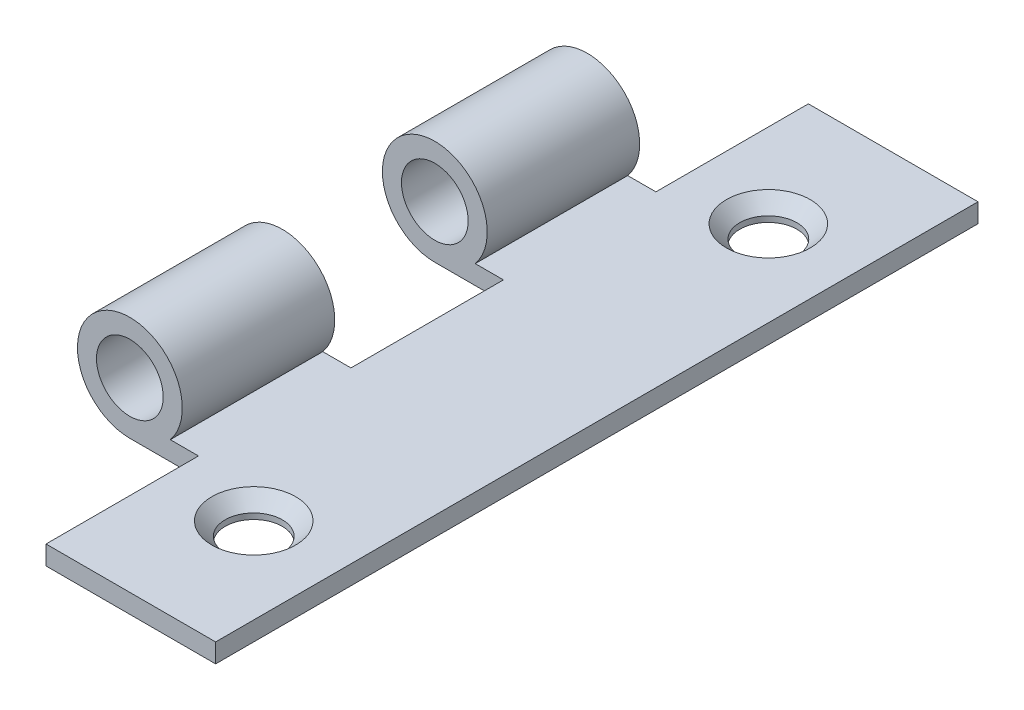
ISO-10303-21;
HEADER;
FILE_DESCRIPTION(('STEP AP214'),'2;1');
FILE_NAME('part.step','',(''),(''),'','','');
FILE_SCHEMA(('AUTOMOTIVE_DESIGN { 1 0 10303 214 1 1 1 1 }'));
ENDSEC;
DATA;
#1=APPLICATION_CONTEXT('core data for automotive mechanical design processes');
#2=APPLICATION_PROTOCOL_DEFINITION('international standard','automotive_design',2000,#1);
#3=PRODUCT_CONTEXT('',#1,'mechanical');
#4=PRODUCT('Part','Part','',(#3));
#5=PRODUCT_RELATED_PRODUCT_CATEGORY('part','',(#4));
#6=PRODUCT_DEFINITION_FORMATION('','',#4);
#7=PRODUCT_DEFINITION_CONTEXT('part definition',#1,'design');
#8=PRODUCT_DEFINITION('design','',#6,#7);
#9=PRODUCT_DEFINITION_SHAPE('','',#8);
#10=(LENGTH_UNIT() NAMED_UNIT(*) SI_UNIT(.MILLI.,.METRE.));
#11=(NAMED_UNIT(*) PLANE_ANGLE_UNIT() SI_UNIT($,.RADIAN.));
#12=(NAMED_UNIT(*) SI_UNIT($,.STERADIAN.) SOLID_ANGLE_UNIT());
#13=UNCERTAINTY_MEASURE_WITH_UNIT(LENGTH_MEASURE(1.E-05),#10,'distance_accuracy_value','');
#14=(GEOMETRIC_REPRESENTATION_CONTEXT(3) GLOBAL_UNCERTAINTY_ASSIGNED_CONTEXT((#13)) GLOBAL_UNIT_ASSIGNED_CONTEXT((#10,
#11,#12)) REPRESENTATION_CONTEXT('',''));
#15=CARTESIAN_POINT('',(0.,0.,0.));
#16=DIRECTION('',(0.,0.,1.));
#17=DIRECTION('',(1.,0.,0.));
#18=AXIS2_PLACEMENT_3D('',#15,#16,#17);
#19=CARTESIAN_POINT('',(12.5,-1.75,40.));
#20=DIRECTION('',(0.,-1.,0.));
#21=DIRECTION('',(1.,0.,0.));
#22=AXIS2_PLACEMENT_3D('',#19,#20,#21);
#23=PLANE('',#22);
#24=CARTESIAN_POINT('',(8.,-1.75,33.5));
#25=DIRECTION('',(0.,1.,0.));
#26=DIRECTION('',(0.,0.,1.));
#27=AXIS2_PLACEMENT_3D('',#24,#25,#26);
#28=CIRCLE('',#27,2.2);
#29=CARTESIAN_POINT('',(8.,-1.75,35.7));
#30=VERTEX_POINT('',#29);
#31=EDGE_CURVE('E236',#30,#30,#28,.T.);
#32=ORIENTED_EDGE('',*,*,#31,.F.);
#33=EDGE_LOOP('',(#32));
#34=FACE_BOUND('',#33,.T.);
#35=CARTESIAN_POINT('',(8.,-1.75,6.5));
#36=DIRECTION('',(0.,1.,0.));
#37=DIRECTION('',(0.,0.,1.));
#38=AXIS2_PLACEMENT_3D('',#35,#36,#37);
#39=CIRCLE('',#38,2.2);
#40=CARTESIAN_POINT('',(8.,-1.75,8.7));
#41=VERTEX_POINT('',#40);
#42=EDGE_CURVE('E226',#41,#41,#39,.T.);
#43=ORIENTED_EDGE('',*,*,#42,.F.);
#44=EDGE_LOOP('',(#43));
#45=FACE_BOUND('',#44,.T.);
#46=DIRECTION('',(1.,0.,0.));
#47=VECTOR('',#46,1.);
#48=CARTESIAN_POINT('',(12.5,-1.75,8.));
#49=LINE('',#48,#47);
#50=CARTESIAN_POINT('',(2.12132034355964,-1.75,8.));
#51=VERTEX_POINT('',#50);
#52=CARTESIAN_POINT('',(3.6,-1.75,8.));
#53=VERTEX_POINT('',#52);
#54=EDGE_CURVE('E125',#51,#53,#49,.T.);
#55=ORIENTED_EDGE('',*,*,#54,.F.);
#56=DIRECTION('',(0.,0.,-1.));
#57=VECTOR('',#56,1.);
#58=CARTESIAN_POINT('',(2.12132034355964,-1.75,40.));
#59=LINE('',#58,#57);
#60=CARTESIAN_POINT('',(2.12132034355964,-1.75,16.));
#61=VERTEX_POINT('',#60);
#62=EDGE_CURVE('E208',#61,#51,#59,.T.);
#63=ORIENTED_EDGE('',*,*,#62,.F.);
#64=DIRECTION('',(-1.,0.,0.));
#65=VECTOR('',#64,1.);
#66=CARTESIAN_POINT('',(12.5,-1.75,16.));
#67=LINE('',#66,#65);
#68=CARTESIAN_POINT('',(3.6,-1.75,16.));
#69=VERTEX_POINT('',#68);
#70=EDGE_CURVE('E175',#69,#61,#67,.T.);
#71=ORIENTED_EDGE('',*,*,#70,.F.);
#72=DIRECTION('',(0.,0.,-1.));
#73=VECTOR('',#72,1.);
#74=CARTESIAN_POINT('',(3.59999999999999,-1.75,40.));
#75=LINE('',#74,#73);
#76=CARTESIAN_POINT('',(3.6,-1.75,24.));
#77=VERTEX_POINT('',#76);
#78=EDGE_CURVE('E186',#77,#69,#75,.T.);
#79=ORIENTED_EDGE('',*,*,#78,.F.);
#80=DIRECTION('',(1.,0.,0.));
#81=VECTOR('',#80,1.);
#82=CARTESIAN_POINT('',(12.5,-1.75,24.));
#83=LINE('',#82,#81);
#84=CARTESIAN_POINT('',(2.12132034355964,-1.75,24.));
#85=VERTEX_POINT('',#84);
#86=EDGE_CURVE('E184',#85,#77,#83,.T.);
#87=ORIENTED_EDGE('',*,*,#86,.F.);
#88=CARTESIAN_POINT('',(2.12132034355964,-1.75,32.));
#89=VERTEX_POINT('',#88);
#90=EDGE_CURVE('E209',#89,#85,#59,.T.);
#91=ORIENTED_EDGE('',*,*,#90,.F.);
#92=DIRECTION('',(-1.,0.,0.));
#93=VECTOR('',#92,1.);
#94=CARTESIAN_POINT('',(12.5,-1.75,32.));
#95=LINE('',#94,#93);
#96=CARTESIAN_POINT('',(3.6,-1.75,32.));
#97=VERTEX_POINT('',#96);
#98=EDGE_CURVE('E162',#97,#89,#95,.T.);
#99=ORIENTED_EDGE('',*,*,#98,.F.);
#100=DIRECTION('',(0.,0.,-1.));
#101=VECTOR('',#100,1.);
#102=CARTESIAN_POINT('',(3.6,-1.75,40.));
#103=LINE('',#102,#101);
#104=CARTESIAN_POINT('',(3.6,-1.75,40.));
#105=VERTEX_POINT('',#104);
#106=EDGE_CURVE('E155',#105,#97,#103,.T.);
#107=ORIENTED_EDGE('',*,*,#106,.F.);
#108=DIRECTION('',(-1.,0.,0.));
#109=VECTOR('',#108,1.);
#110=CARTESIAN_POINT('',(12.5,-1.75,40.));
#111=LINE('',#110,#109);
#112=CARTESIAN_POINT('',(12.5,-1.75,40.));
#113=VERTEX_POINT('',#112);
#114=EDGE_CURVE('E192',#113,#105,#111,.T.);
#115=ORIENTED_EDGE('',*,*,#114,.F.);
#116=DIRECTION('',(0.,0.,-1.));
#117=VECTOR('',#116,1.);
#118=CARTESIAN_POINT('',(12.5,-1.75,40.));
#119=LINE('',#118,#117);
#120=CARTESIAN_POINT('',(12.5,-1.75,0.));
#121=VERTEX_POINT('',#120);
#122=EDGE_CURVE('E211',#113,#121,#119,.T.);
#123=ORIENTED_EDGE('',*,*,#122,.T.);
#124=DIRECTION('',(-1.,0.,0.));
#125=VECTOR('',#124,1.);
#126=CARTESIAN_POINT('',(12.5,-1.75,0.));
#127=LINE('',#126,#125);
#128=CARTESIAN_POINT('',(3.6,-1.75,0.));
#129=VERTEX_POINT('',#128);
#130=EDGE_CURVE('E144',#121,#129,#127,.T.);
#131=ORIENTED_EDGE('',*,*,#130,.T.);
#132=DIRECTION('',(0.,0.,-1.));
#133=VECTOR('',#132,1.);
#134=CARTESIAN_POINT('',(3.6,-1.75,40.));
#135=LINE('',#134,#133);
#136=EDGE_CURVE('E49',#53,#129,#135,.T.);
#137=ORIENTED_EDGE('',*,*,#136,.F.);
#138=EDGE_LOOP('',(#55,#63,#71,#79,#87,#91,#99,#107,#115,#123,#131,#137));
#139=FACE_BOUND('',#138,.T.);
#140=ADVANCED_FACE('F33',(#34,#45,#139),#23,.F.);
#141=CARTESIAN_POINT('',(12.5,-2.75,40.));
#142=DIRECTION('',(0.,1.,0.));
#143=DIRECTION('',(-1.,0.,0.));
#144=AXIS2_PLACEMENT_3D('',#141,#142,#143);
#145=PLANE('',#144);
#146=CARTESIAN_POINT('',(8.,-2.75,33.5));
#147=DIRECTION('',(0.,1.,0.));
#148=DIRECTION('',(-1.,0.,0.));
#149=AXIS2_PLACEMENT_3D('',#146,#147,#148);
#150=CIRCLE('',#149,1.49999999999999);
#151=CARTESIAN_POINT('',(6.50000000000001,-2.75,33.5));
#152=VERTEX_POINT('',#151);
#153=EDGE_CURVE('E37',#152,#152,#150,.T.);
#154=ORIENTED_EDGE('',*,*,#153,.T.);
#155=EDGE_LOOP('',(#154));
#156=FACE_BOUND('',#155,.T.);
#157=CARTESIAN_POINT('',(8.,-2.75,6.5));
#158=DIRECTION('',(0.,1.,0.));
#159=DIRECTION('',(-1.,0.,0.));
#160=AXIS2_PLACEMENT_3D('',#157,#158,#159);
#161=CIRCLE('',#160,1.49999999999999);
#162=CARTESIAN_POINT('',(6.50000000000001,-2.75,6.5));
#163=VERTEX_POINT('',#162);
#164=EDGE_CURVE('E140',#163,#163,#161,.T.);
#165=ORIENTED_EDGE('',*,*,#164,.T.);
#166=EDGE_LOOP('',(#165));
#167=FACE_BOUND('',#166,.T.);
#168=DIRECTION('',(-1.,0.,0.));
#169=VECTOR('',#168,1.);
#170=CARTESIAN_POINT('',(12.5,-2.75,8.));
#171=LINE('',#170,#169);
#172=CARTESIAN_POINT('',(3.6,-2.75,8.));
#173=VERTEX_POINT('',#172);
#174=CARTESIAN_POINT('',(0.,-2.75,8.));
#175=VERTEX_POINT('',#174);
#176=EDGE_CURVE('E135',#173,#175,#171,.T.);
#177=ORIENTED_EDGE('',*,*,#176,.F.);
#178=DIRECTION('',(0.,0.,1.));
#179=VECTOR('',#178,1.);
#180=CARTESIAN_POINT('',(3.6,-2.75,40.));
#181=LINE('',#180,#179);
#182=CARTESIAN_POINT('',(3.6,-2.75,0.));
#183=VERTEX_POINT('',#182);
#184=EDGE_CURVE('E139',#183,#173,#181,.T.);
#185=ORIENTED_EDGE('',*,*,#184,.F.);
#186=DIRECTION('',(1.,0.,0.));
#187=VECTOR('',#186,1.);
#188=CARTESIAN_POINT('',(12.5,-2.75,0.));
#189=LINE('',#188,#187);
#190=CARTESIAN_POINT('',(12.5,-2.75,0.));
#191=VERTEX_POINT('',#190);
#192=EDGE_CURVE('E193',#183,#191,#189,.T.);
#193=ORIENTED_EDGE('',*,*,#192,.T.);
#194=DIRECTION('',(0.,0.,-1.));
#195=VECTOR('',#194,1.);
#196=CARTESIAN_POINT('',(12.5,-2.75,40.));
#197=LINE('',#196,#195);
#198=CARTESIAN_POINT('',(12.5,-2.75,40.));
#199=VERTEX_POINT('',#198);
#200=EDGE_CURVE('E198',#199,#191,#197,.T.);
#201=ORIENTED_EDGE('',*,*,#200,.F.);
#202=DIRECTION('',(1.,0.,0.));
#203=VECTOR('',#202,1.);
#204=CARTESIAN_POINT('',(12.5,-2.75,40.));
#205=LINE('',#204,#203);
#206=CARTESIAN_POINT('',(3.6,-2.75,40.));
#207=VERTEX_POINT('',#206);
#208=EDGE_CURVE('E196',#207,#199,#205,.T.);
#209=ORIENTED_EDGE('',*,*,#208,.F.);
#210=DIRECTION('',(0.,0.,1.));
#211=VECTOR('',#210,1.);
#212=CARTESIAN_POINT('',(3.6,-2.75,40.));
#213=LINE('',#212,#211);
#214=CARTESIAN_POINT('',(3.6,-2.75,32.));
#215=VERTEX_POINT('',#214);
#216=EDGE_CURVE('E57',#215,#207,#213,.T.);
#217=ORIENTED_EDGE('',*,*,#216,.F.);
#218=DIRECTION('',(1.,0.,0.));
#219=VECTOR('',#218,1.);
#220=CARTESIAN_POINT('',(12.5,-2.75,32.));
#221=LINE('',#220,#219);
#222=CARTESIAN_POINT('',(0.,-2.75,32.));
#223=VERTEX_POINT('',#222);
#224=EDGE_CURVE('E158',#223,#215,#221,.T.);
#225=ORIENTED_EDGE('',*,*,#224,.F.);
#226=DIRECTION('',(0.,0.,-1.));
#227=VECTOR('',#226,1.);
#228=CARTESIAN_POINT('',(0.,-2.75,40.));
#229=LINE('',#228,#227);
#230=CARTESIAN_POINT('',(0.,-2.75,24.));
#231=VERTEX_POINT('',#230);
#232=EDGE_CURVE('E206',#223,#231,#229,.T.);
#233=ORIENTED_EDGE('',*,*,#232,.T.);
#234=DIRECTION('',(-1.,0.,0.));
#235=VECTOR('',#234,1.);
#236=CARTESIAN_POINT('',(12.5,-2.75,24.));
#237=LINE('',#236,#235);
#238=CARTESIAN_POINT('',(3.6,-2.75,24.));
#239=VERTEX_POINT('',#238);
#240=EDGE_CURVE('E178',#239,#231,#237,.T.);
#241=ORIENTED_EDGE('',*,*,#240,.F.);
#242=DIRECTION('',(0.,0.,1.));
#243=VECTOR('',#242,1.);
#244=CARTESIAN_POINT('',(3.59999999999999,-2.75,40.));
#245=LINE('',#244,#243);
#246=CARTESIAN_POINT('',(3.6,-2.75,16.));
#247=VERTEX_POINT('',#246);
#248=EDGE_CURVE('E213',#247,#239,#245,.T.);
#249=ORIENTED_EDGE('',*,*,#248,.F.);
#250=DIRECTION('',(1.,0.,0.));
#251=VECTOR('',#250,1.);
#252=CARTESIAN_POINT('',(12.5,-2.75,16.));
#253=LINE('',#252,#251);
#254=CARTESIAN_POINT('',(0.,-2.75,16.));
#255=VERTEX_POINT('',#254);
#256=EDGE_CURVE('E171',#255,#247,#253,.T.);
#257=ORIENTED_EDGE('',*,*,#256,.F.);
#258=EDGE_CURVE('E205',#255,#175,#229,.T.);
#259=ORIENTED_EDGE('',*,*,#258,.T.);
#260=EDGE_LOOP('',(#177,#185,#193,#201,#209,#217,#225,#233,#241,#249,#257,#259));
#261=FACE_BOUND('',#260,.T.);
#262=ADVANCED_FACE('F244',(#156,#167,#261),#145,.F.);
#263=CARTESIAN_POINT('',(0.,0.,40.));
#264=DIRECTION('',(0.,0.,-1.));
#265=DIRECTION('',(-1.,0.,0.));
#266=AXIS2_PLACEMENT_3D('',#263,#264,#265);
#267=CYLINDRICAL_SURFACE('',#266,2.75);
#268=CARTESIAN_POINT('',(0.,0.,8.));
#269=DIRECTION('',(0.,0.,-1.));
#270=DIRECTION('',(-1.,0.,0.));
#271=AXIS2_PLACEMENT_3D('',#268,#269,#270);
#272=CIRCLE('',#271,2.75);
#273=EDGE_CURVE('E130',#175,#51,#272,.T.);
#274=ORIENTED_EDGE('',*,*,#273,.F.);
#275=ORIENTED_EDGE('',*,*,#258,.F.);
#276=CARTESIAN_POINT('',(0.,0.,16.));
#277=DIRECTION('',(0.,0.,1.));
#278=DIRECTION('',(1.,0.,0.));
#279=AXIS2_PLACEMENT_3D('',#276,#277,#278);
#280=CIRCLE('',#279,2.75);
#281=EDGE_CURVE('E173',#61,#255,#280,.T.);
#282=ORIENTED_EDGE('',*,*,#281,.F.);
#283=ORIENTED_EDGE('',*,*,#62,.T.);
#284=EDGE_LOOP('',(#274,#275,#282,#283));
#285=FACE_BOUND('',#284,.T.);
#286=ADVANCED_FACE('F302',(#285),#267,.T.);
#287=CARTESIAN_POINT('',(0.,0.,40.));
#288=DIRECTION('',(0.,0.,-1.));
#289=DIRECTION('',(-1.,0.,0.));
#290=AXIS2_PLACEMENT_3D('',#287,#288,#289);
#291=CYLINDRICAL_SURFACE('',#290,1.75);
#292=CARTESIAN_POINT('',(0.,0.,16.));
#293=DIRECTION('',(0.,0.,1.));
#294=DIRECTION('',(1.,0.,0.));
#295=AXIS2_PLACEMENT_3D('',#292,#293,#294);
#296=CIRCLE('',#295,1.75);
#297=CARTESIAN_POINT('',(1.75,0.,16.));
#298=VERTEX_POINT('',#297);
#299=EDGE_CURVE('E170',#298,#298,#296,.T.);
#300=ORIENTED_EDGE('',*,*,#299,.T.);
#301=EDGE_LOOP('',(#300));
#302=FACE_BOUND('',#301,.T.);
#303=CARTESIAN_POINT('',(0.,0.,8.));
#304=DIRECTION('',(0.,0.,-1.));
#305=DIRECTION('',(-1.,0.,0.));
#306=AXIS2_PLACEMENT_3D('',#303,#304,#305);
#307=CIRCLE('',#306,1.75);
#308=CARTESIAN_POINT('',(-1.75,0.,8.));
#309=VERTEX_POINT('',#308);
#310=EDGE_CURVE('E145',#309,#309,#307,.T.);
#311=ORIENTED_EDGE('',*,*,#310,.T.);
#312=EDGE_LOOP('',(#311));
#313=FACE_BOUND('',#312,.T.);
#314=ADVANCED_FACE('F292',(#302,#313),#291,.F.);
#315=CARTESIAN_POINT('',(0.,0.,0.));
#316=DIRECTION('',(0.,0.,1.));
#317=DIRECTION('',(1.,0.,0.));
#318=AXIS2_PLACEMENT_3D('',#315,#316,#317);
#319=PLANE('',#318);
#320=DIRECTION('',(0.,-1.,0.));
#321=VECTOR('',#320,1.);
#322=CARTESIAN_POINT('',(3.6,0.,0.));
#323=LINE('',#322,#321);
#324=EDGE_CURVE('E11',#129,#183,#323,.T.);
#325=ORIENTED_EDGE('',*,*,#324,.F.);
#326=ORIENTED_EDGE('',*,*,#130,.F.);
#327=DIRECTION('',(0.,1.,0.));
#328=VECTOR('',#327,1.);
#329=CARTESIAN_POINT('',(12.5,-1.75,0.));
#330=LINE('',#329,#328);
#331=EDGE_CURVE('E188',#191,#121,#330,.T.);
#332=ORIENTED_EDGE('',*,*,#331,.F.);
#333=ORIENTED_EDGE('',*,*,#192,.F.);
#334=EDGE_LOOP('',(#325,#326,#332,#333));
#335=FACE_BOUND('',#334,.T.);
#336=ADVANCED_FACE('F296',(#335),#319,.F.);
#337=CARTESIAN_POINT('',(0.,0.,32.));
#338=DIRECTION('',(0.,0.,1.));
#339=DIRECTION('',(1.,0.,0.));
#340=AXIS2_PLACEMENT_3D('',#337,#338,#339);
#341=CIRCLE('',#340,2.75);
#342=EDGE_CURVE('E160',#89,#223,#341,.T.);
#343=ORIENTED_EDGE('',*,*,#342,.F.);
#344=ORIENTED_EDGE('',*,*,#90,.T.);
#345=CARTESIAN_POINT('',(0.,0.,24.));
#346=DIRECTION('',(0.,0.,-1.));
#347=DIRECTION('',(-1.,0.,0.));
#348=AXIS2_PLACEMENT_3D('',#345,#346,#347);
#349=CIRCLE('',#348,2.75);
#350=EDGE_CURVE('E181',#231,#85,#349,.T.);
#351=ORIENTED_EDGE('',*,*,#350,.F.);
#352=ORIENTED_EDGE('',*,*,#232,.F.);
#353=EDGE_LOOP('',(#343,#344,#351,#352));
#354=FACE_BOUND('',#353,.T.);
#355=ADVANCED_FACE('F290',(#354),#267,.T.);
#356=CARTESIAN_POINT('',(0.,0.,24.));
#357=DIRECTION('',(0.,0.,-1.));
#358=DIRECTION('',(-1.,0.,0.));
#359=AXIS2_PLACEMENT_3D('',#356,#357,#358);
#360=CIRCLE('',#359,1.75);
#361=CARTESIAN_POINT('',(-1.75,0.,24.));
#362=VERTEX_POINT('',#361);
#363=EDGE_CURVE('E177',#362,#362,#360,.T.);
#364=ORIENTED_EDGE('',*,*,#363,.T.);
#365=EDGE_LOOP('',(#364));
#366=FACE_BOUND('',#365,.T.);
#367=CARTESIAN_POINT('',(0.,0.,32.));
#368=DIRECTION('',(0.,0.,1.));
#369=DIRECTION('',(1.,0.,0.));
#370=AXIS2_PLACEMENT_3D('',#367,#368,#369);
#371=CIRCLE('',#370,1.75);
#372=CARTESIAN_POINT('',(1.75,0.,32.));
#373=VERTEX_POINT('',#372);
#374=EDGE_CURVE('E157',#373,#373,#371,.T.);
#375=ORIENTED_EDGE('',*,*,#374,.T.);
#376=EDGE_LOOP('',(#375));
#377=FACE_BOUND('',#376,.T.);
#378=ADVANCED_FACE('F286',(#366,#377),#291,.F.);
#379=CARTESIAN_POINT('',(0.,0.,40.));
#380=DIRECTION('',(0.,0.,1.));
#381=DIRECTION('',(1.,0.,0.));
#382=AXIS2_PLACEMENT_3D('',#379,#380,#381);
#383=PLANE('',#382);
#384=ORIENTED_EDGE('',*,*,#114,.T.);
#385=DIRECTION('',(0.,-1.,0.));
#386=VECTOR('',#385,1.);
#387=CARTESIAN_POINT('',(3.6,0.,40.));
#388=LINE('',#387,#386);
#389=EDGE_CURVE('E42',#105,#207,#388,.T.);
#390=ORIENTED_EDGE('',*,*,#389,.T.);
#391=ORIENTED_EDGE('',*,*,#208,.T.);
#392=DIRECTION('',(0.,1.,0.));
#393=VECTOR('',#392,1.);
#394=CARTESIAN_POINT('',(12.5,-1.75,40.));
#395=LINE('',#394,#393);
#396=EDGE_CURVE('E189',#199,#113,#395,.T.);
#397=ORIENTED_EDGE('',*,*,#396,.T.);
#398=EDGE_LOOP('',(#384,#390,#391,#397));
#399=FACE_BOUND('',#398,.T.);
#400=ADVANCED_FACE('F289',(#399),#383,.T.);
#401=CARTESIAN_POINT('',(12.5,-1.75,40.));
#402=DIRECTION('',(-1.,0.,0.));
#403=DIRECTION('',(0.,0.,1.));
#404=AXIS2_PLACEMENT_3D('',#401,#402,#403);
#405=PLANE('',#404);
#406=ORIENTED_EDGE('',*,*,#331,.T.);
#407=ORIENTED_EDGE('',*,*,#122,.F.);
#408=ORIENTED_EDGE('',*,*,#396,.F.);
#409=ORIENTED_EDGE('',*,*,#200,.T.);
#410=EDGE_LOOP('',(#406,#407,#408,#409));
#411=FACE_BOUND('',#410,.T.);
#412=ADVANCED_FACE('F35',(#411),#405,.F.);
#413=CARTESIAN_POINT('',(3.6,18.25,16.));
#414=DIRECTION('',(-1.,0.,0.));
#415=DIRECTION('',(0.,0.,1.));
#416=AXIS2_PLACEMENT_3D('',#413,#414,#415);
#417=PLANE('',#416);
#418=ORIENTED_EDGE('',*,*,#78,.T.);
#419=DIRECTION('',(0.,-1.,0.));
#420=VECTOR('',#419,1.);
#421=CARTESIAN_POINT('',(3.6,18.25,16.));
#422=LINE('',#421,#420);
#423=EDGE_CURVE('E164',#69,#247,#422,.T.);
#424=ORIENTED_EDGE('',*,*,#423,.T.);
#425=ORIENTED_EDGE('',*,*,#248,.T.);
#426=DIRECTION('',(0.,-1.,0.));
#427=VECTOR('',#426,1.);
#428=CARTESIAN_POINT('',(3.59999999999999,18.25,24.));
#429=LINE('',#428,#427);
#430=EDGE_CURVE('E167',#77,#239,#429,.T.);
#431=ORIENTED_EDGE('',*,*,#430,.F.);
#432=EDGE_LOOP('',(#418,#424,#425,#431));
#433=FACE_BOUND('',#432,.T.);
#434=ADVANCED_FACE('F279',(#433),#417,.T.);
#435=CARTESIAN_POINT('',(-14.2,18.25,24.));
#436=DIRECTION('',(0.,0.,-1.));
#437=DIRECTION('',(-1.,0.,0.));
#438=AXIS2_PLACEMENT_3D('',#435,#436,#437);
#439=PLANE('',#438);
#440=ORIENTED_EDGE('',*,*,#363,.F.);
#441=EDGE_LOOP('',(#440));
#442=FACE_BOUND('',#441,.T.);
#443=ORIENTED_EDGE('',*,*,#86,.T.);
#444=ORIENTED_EDGE('',*,*,#430,.T.);
#445=ORIENTED_EDGE('',*,*,#240,.T.);
#446=ORIENTED_EDGE('',*,*,#350,.T.);
#447=EDGE_LOOP('',(#443,#444,#445,#446));
#448=FACE_BOUND('',#447,.T.);
#449=ADVANCED_FACE('F277',(#442,#448),#439,.T.);
#450=CARTESIAN_POINT('',(-14.2,18.25,16.));
#451=DIRECTION('',(0.,0.,1.));
#452=DIRECTION('',(1.,0.,0.));
#453=AXIS2_PLACEMENT_3D('',#450,#451,#452);
#454=PLANE('',#453);
#455=ORIENTED_EDGE('',*,*,#299,.F.);
#456=EDGE_LOOP('',(#455));
#457=FACE_BOUND('',#456,.T.);
#458=ORIENTED_EDGE('',*,*,#70,.T.);
#459=ORIENTED_EDGE('',*,*,#281,.T.);
#460=ORIENTED_EDGE('',*,*,#256,.T.);
#461=ORIENTED_EDGE('',*,*,#423,.F.);
#462=EDGE_LOOP('',(#458,#459,#460,#461));
#463=FACE_BOUND('',#462,.T.);
#464=ADVANCED_FACE('F271',(#457,#463),#454,.T.);
#465=CARTESIAN_POINT('',(-14.2,18.25,32.));
#466=DIRECTION('',(0.,0.,1.));
#467=DIRECTION('',(1.,0.,0.));
#468=AXIS2_PLACEMENT_3D('',#465,#466,#467);
#469=PLANE('',#468);
#470=ORIENTED_EDGE('',*,*,#374,.F.);
#471=EDGE_LOOP('',(#470));
#472=FACE_BOUND('',#471,.T.);
#473=ORIENTED_EDGE('',*,*,#98,.T.);
#474=ORIENTED_EDGE('',*,*,#342,.T.);
#475=ORIENTED_EDGE('',*,*,#224,.T.);
#476=DIRECTION('',(0.,-1.,0.));
#477=VECTOR('',#476,1.);
#478=CARTESIAN_POINT('',(3.6,18.25,32.));
#479=LINE('',#478,#477);
#480=EDGE_CURVE('E134',#97,#215,#479,.T.);
#481=ORIENTED_EDGE('',*,*,#480,.F.);
#482=EDGE_LOOP('',(#473,#474,#475,#481));
#483=FACE_BOUND('',#482,.T.);
#484=ADVANCED_FACE('F268',(#472,#483),#469,.T.);
#485=CARTESIAN_POINT('',(3.6,18.25,32.));
#486=DIRECTION('',(-1.,0.,0.));
#487=DIRECTION('',(0.,-1.,0.));
#488=AXIS2_PLACEMENT_3D('',#485,#486,#487);
#489=PLANE('',#488);
#490=ORIENTED_EDGE('',*,*,#106,.T.);
#491=ORIENTED_EDGE('',*,*,#480,.T.);
#492=ORIENTED_EDGE('',*,*,#216,.T.);
#493=ORIENTED_EDGE('',*,*,#389,.F.);
#494=EDGE_LOOP('',(#490,#491,#492,#493));
#495=FACE_BOUND('',#494,.T.);
#496=ADVANCED_FACE('F266',(#495),#489,.T.);
#497=CARTESIAN_POINT('',(-14.2,18.25,8.));
#498=DIRECTION('',(0.,0.,-1.));
#499=DIRECTION('',(-1.,0.,0.));
#500=AXIS2_PLACEMENT_3D('',#497,#498,#499);
#501=PLANE('',#500);
#502=ORIENTED_EDGE('',*,*,#310,.F.);
#503=EDGE_LOOP('',(#502));
#504=FACE_BOUND('',#503,.T.);
#505=ORIENTED_EDGE('',*,*,#54,.T.);
#506=DIRECTION('',(0.,-1.,0.));
#507=VECTOR('',#506,1.);
#508=CARTESIAN_POINT('',(3.6,18.25,8.));
#509=LINE('',#508,#507);
#510=EDGE_CURVE('E127',#53,#173,#509,.T.);
#511=ORIENTED_EDGE('',*,*,#510,.T.);
#512=ORIENTED_EDGE('',*,*,#176,.T.);
#513=ORIENTED_EDGE('',*,*,#273,.T.);
#514=EDGE_LOOP('',(#505,#511,#512,#513));
#515=FACE_BOUND('',#514,.T.);
#516=ADVANCED_FACE('F126',(#504,#515),#501,.T.);
#517=CARTESIAN_POINT('',(3.6,18.25,0.));
#518=DIRECTION('',(-1.,0.,0.));
#519=DIRECTION('',(0.,-1.,0.));
#520=AXIS2_PLACEMENT_3D('',#517,#518,#519);
#521=PLANE('',#520);
#522=ORIENTED_EDGE('',*,*,#136,.T.);
#523=ORIENTED_EDGE('',*,*,#324,.T.);
#524=ORIENTED_EDGE('',*,*,#184,.T.);
#525=ORIENTED_EDGE('',*,*,#510,.F.);
#526=EDGE_LOOP('',(#522,#523,#524,#525));
#527=FACE_BOUND('',#526,.T.);
#528=ADVANCED_FACE('F137',(#527),#521,.T.);
#529=CARTESIAN_POINT('',(8.,-1.75,6.5));
#530=DIRECTION('',(0.,1.,0.));
#531=DIRECTION('',(0.,0.,1.));
#532=AXIS2_PLACEMENT_3D('',#529,#530,#531);
#533=CYLINDRICAL_SURFACE('',#532,1.49999999999999);
#534=CARTESIAN_POINT('',(8.,-2.45,6.5));
#535=DIRECTION('',(0.,1.,0.));
#536=DIRECTION('',(0.,0.,1.));
#537=AXIS2_PLACEMENT_3D('',#534,#535,#536);
#538=CIRCLE('',#537,1.5);
#539=CARTESIAN_POINT('',(8.,-2.45,8.));
#540=VERTEX_POINT('',#539);
#541=EDGE_CURVE('E222',#540,#540,#538,.T.);
#542=ORIENTED_EDGE('',*,*,#541,.T.);
#543=EDGE_LOOP('',(#542));
#544=FACE_BOUND('',#543,.T.);
#545=ORIENTED_EDGE('',*,*,#164,.F.);
#546=EDGE_LOOP('',(#545));
#547=FACE_BOUND('',#546,.T.);
#548=ADVANCED_FACE('F250',(#544,#547),#533,.F.);
#549=CARTESIAN_POINT('',(8.,-1.75,6.5));
#550=DIRECTION('',(0.,1.,0.));
#551=DIRECTION('',(0.,0.,1.));
#552=AXIS2_PLACEMENT_3D('',#549,#550,#551);
#553=CONICAL_SURFACE('',#552,2.2,0.785398163397451);
#554=ORIENTED_EDGE('',*,*,#541,.F.);
#555=EDGE_LOOP('',(#554));
#556=FACE_BOUND('',#555,.T.);
#557=ORIENTED_EDGE('',*,*,#42,.T.);
#558=EDGE_LOOP('',(#557));
#559=FACE_BOUND('',#558,.T.);
#560=ADVANCED_FACE('F247',(#556,#559),#553,.F.);
#561=CARTESIAN_POINT('',(8.,-1.75,33.5));
#562=DIRECTION('',(0.,1.,0.));
#563=DIRECTION('',(0.,0.,1.));
#564=AXIS2_PLACEMENT_3D('',#561,#562,#563);
#565=CYLINDRICAL_SURFACE('',#564,1.49999999999999);
#566=CARTESIAN_POINT('',(8.,-2.45,33.5));
#567=DIRECTION('',(0.,1.,0.));
#568=DIRECTION('',(0.,0.,1.));
#569=AXIS2_PLACEMENT_3D('',#566,#567,#568);
#570=CIRCLE('',#569,1.5);
#571=CARTESIAN_POINT('',(8.,-2.45,35.));
#572=VERTEX_POINT('',#571);
#573=EDGE_CURVE('E233',#572,#572,#570,.T.);
#574=ORIENTED_EDGE('',*,*,#573,.T.);
#575=EDGE_LOOP('',(#574));
#576=FACE_BOUND('',#575,.T.);
#577=ORIENTED_EDGE('',*,*,#153,.F.);
#578=EDGE_LOOP('',(#577));
#579=FACE_BOUND('',#578,.T.);
#580=ADVANCED_FACE('F249',(#576,#579),#565,.F.);
#581=CARTESIAN_POINT('',(8.,-1.75,33.5));
#582=DIRECTION('',(0.,1.,0.));
#583=DIRECTION('',(0.,0.,1.));
#584=AXIS2_PLACEMENT_3D('',#581,#582,#583);
#585=CONICAL_SURFACE('',#584,2.2,0.785398163397451);
#586=ORIENTED_EDGE('',*,*,#573,.F.);
#587=EDGE_LOOP('',(#586));
#588=FACE_BOUND('',#587,.T.);
#589=ORIENTED_EDGE('',*,*,#31,.T.);
#590=EDGE_LOOP('',(#589));
#591=FACE_BOUND('',#590,.T.);
#592=ADVANCED_FACE('F240',(#588,#591),#585,.F.);
#593=CLOSED_SHELL('',(#140,#262,#286,#314,#336,#355,#378,#400,#412,#434,#449,#464,#484,#496,
#516,#528,#548,#560,#580,#592));
#594=MANIFOLD_SOLID_BREP('B2',#593);
#595=ADVANCED_BREP_SHAPE_REPRESENTATION('',(#18,#594),#14);
#596=SHAPE_DEFINITION_REPRESENTATION(#9,#595);
ENDSEC;
END-ISO-10303-21;
